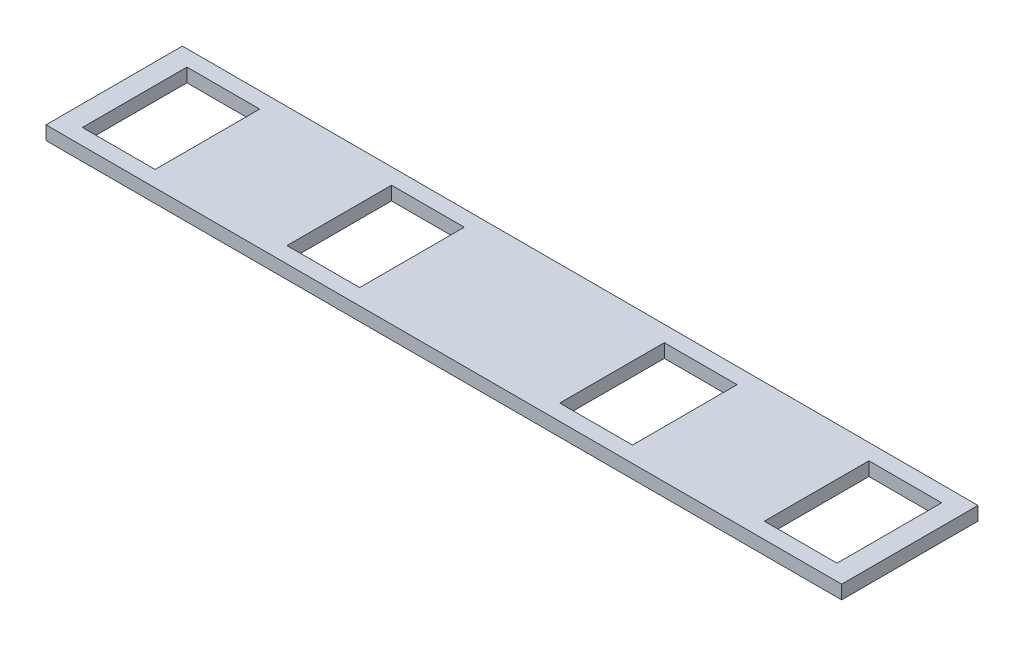
ISO-10303-21;
HEADER;
FILE_DESCRIPTION(('STEP AP214'),'2;1');
FILE_NAME('part.step','',(''),(''),'','','');
FILE_SCHEMA(('AUTOMOTIVE_DESIGN { 1 0 10303 214 1 1 1 1 }'));
ENDSEC;
DATA;
#1=APPLICATION_CONTEXT('core data for automotive mechanical design processes');
#2=APPLICATION_PROTOCOL_DEFINITION('international standard','automotive_design',2000,#1);
#3=PRODUCT_CONTEXT('',#1,'mechanical');
#4=PRODUCT('Part','Part','',(#3));
#5=PRODUCT_RELATED_PRODUCT_CATEGORY('part','',(#4));
#6=PRODUCT_DEFINITION_FORMATION('','',#4);
#7=PRODUCT_DEFINITION_CONTEXT('part definition',#1,'design');
#8=PRODUCT_DEFINITION('design','',#6,#7);
#9=PRODUCT_DEFINITION_SHAPE('','',#8);
#10=(LENGTH_UNIT() NAMED_UNIT(*) SI_UNIT(.MILLI.,.METRE.));
#11=(NAMED_UNIT(*) PLANE_ANGLE_UNIT() SI_UNIT($,.RADIAN.));
#12=(NAMED_UNIT(*) SI_UNIT($,.STERADIAN.) SOLID_ANGLE_UNIT());
#13=UNCERTAINTY_MEASURE_WITH_UNIT(LENGTH_MEASURE(1.E-05),#10,'distance_accuracy_value','');
#14=(GEOMETRIC_REPRESENTATION_CONTEXT(3) GLOBAL_UNCERTAINTY_ASSIGNED_CONTEXT((#13)) GLOBAL_UNIT_ASSIGNED_CONTEXT((#10,
#11,#12)) REPRESENTATION_CONTEXT('',''));
#15=CARTESIAN_POINT('',(0.,0.,0.));
#16=DIRECTION('',(0.,0.,1.));
#17=DIRECTION('',(1.,0.,0.));
#18=AXIS2_PLACEMENT_3D('',#15,#16,#17);
#19=CARTESIAN_POINT('',(0.,3.,0.));
#20=DIRECTION('',(0.,-1.,0.));
#21=DIRECTION('',(0.,0.,-1.));
#22=AXIS2_PLACEMENT_3D('',#19,#20,#21);
#23=PLANE('',#22);
#24=DIRECTION('',(1.,0.,0.));
#25=VECTOR('',#24,1.);
#26=CARTESIAN_POINT('',(38.,3.,11.5));
#27=LINE('',#26,#25);
#28=CARTESIAN_POINT('',(22.,3.,11.5));
#29=VERTEX_POINT('',#28);
#30=CARTESIAN_POINT('',(38.,3.,11.5));
#31=VERTEX_POINT('',#30);
#32=EDGE_CURVE('E212',#29,#31,#27,.T.);
#33=ORIENTED_EDGE('',*,*,#32,.F.);
#34=DIRECTION('',(0.,0.,1.));
#35=VECTOR('',#34,1.);
#36=CARTESIAN_POINT('',(22.,3.,11.5));
#37=LINE('',#36,#35);
#38=CARTESIAN_POINT('',(22.,3.,-11.5));
#39=VERTEX_POINT('',#38);
#40=EDGE_CURVE('E220',#39,#29,#37,.T.);
#41=ORIENTED_EDGE('',*,*,#40,.F.);
#42=DIRECTION('',(-1.,0.,0.));
#43=VECTOR('',#42,1.);
#44=CARTESIAN_POINT('',(38.,3.,-11.5));
#45=LINE('',#44,#43);
#46=CARTESIAN_POINT('',(38.,3.,-11.5));
#47=VERTEX_POINT('',#46);
#48=EDGE_CURVE('E217',#47,#39,#45,.T.);
#49=ORIENTED_EDGE('',*,*,#48,.F.);
#50=DIRECTION('',(0.,0.,-1.));
#51=VECTOR('',#50,1.);
#52=CARTESIAN_POINT('',(38.,3.,11.5));
#53=LINE('',#52,#51);
#54=EDGE_CURVE('E214',#31,#47,#53,.T.);
#55=ORIENTED_EDGE('',*,*,#54,.F.);
#56=EDGE_LOOP('',(#33,#41,#49,#55));
#57=FACE_BOUND('',#56,.T.);
#58=DIRECTION('',(0.,0.,-1.));
#59=VECTOR('',#58,1.);
#60=CARTESIAN_POINT('',(-22.,3.,11.5));
#61=LINE('',#60,#59);
#62=CARTESIAN_POINT('',(-22.,3.,11.5));
#63=VERTEX_POINT('',#62);
#64=CARTESIAN_POINT('',(-22.,3.,-11.5));
#65=VERTEX_POINT('',#64);
#66=EDGE_CURVE('E274',#63,#65,#61,.T.);
#67=ORIENTED_EDGE('',*,*,#66,.F.);
#68=DIRECTION('',(1.,0.,0.));
#69=VECTOR('',#68,1.);
#70=CARTESIAN_POINT('',(-38.,3.,11.5));
#71=LINE('',#70,#69);
#72=CARTESIAN_POINT('',(-38.,3.,11.5));
#73=VERTEX_POINT('',#72);
#74=EDGE_CURVE('E282',#73,#63,#71,.T.);
#75=ORIENTED_EDGE('',*,*,#74,.F.);
#76=DIRECTION('',(0.,0.,1.));
#77=VECTOR('',#76,1.);
#78=CARTESIAN_POINT('',(-38.,3.,11.5));
#79=LINE('',#78,#77);
#80=CARTESIAN_POINT('',(-38.,3.,-11.5));
#81=VERTEX_POINT('',#80);
#82=EDGE_CURVE('E279',#81,#73,#79,.T.);
#83=ORIENTED_EDGE('',*,*,#82,.F.);
#84=DIRECTION('',(-1.,0.,0.));
#85=VECTOR('',#84,1.);
#86=CARTESIAN_POINT('',(-38.,3.,-11.5));
#87=LINE('',#86,#85);
#88=EDGE_CURVE('E276',#65,#81,#87,.T.);
#89=ORIENTED_EDGE('',*,*,#88,.F.);
#90=EDGE_LOOP('',(#67,#75,#83,#89));
#91=FACE_BOUND('',#90,.T.);
#92=DIRECTION('',(0.,0.,-1.));
#93=VECTOR('',#92,1.);
#94=CARTESIAN_POINT('',(87.5,3.,15.));
#95=LINE('',#94,#93);
#96=CARTESIAN_POINT('',(87.5,3.,15.));
#97=VERTEX_POINT('',#96);
#98=CARTESIAN_POINT('',(87.5,3.,-15.));
#99=VERTEX_POINT('',#98);
#100=EDGE_CURVE('E305',#97,#99,#95,.T.);
#101=ORIENTED_EDGE('',*,*,#100,.T.);
#102=DIRECTION('',(-1.,0.,0.));
#103=VECTOR('',#102,1.);
#104=CARTESIAN_POINT('',(-87.5,3.,-15.));
#105=LINE('',#104,#103);
#106=CARTESIAN_POINT('',(-87.5,3.,-15.));
#107=VERTEX_POINT('',#106);
#108=EDGE_CURVE('E308',#99,#107,#105,.T.);
#109=ORIENTED_EDGE('',*,*,#108,.T.);
#110=DIRECTION('',(0.,0.,1.));
#111=VECTOR('',#110,1.);
#112=CARTESIAN_POINT('',(-87.5,3.,15.));
#113=LINE('',#112,#111);
#114=CARTESIAN_POINT('',(-87.5,3.,15.));
#115=VERTEX_POINT('',#114);
#116=EDGE_CURVE('E311',#107,#115,#113,.T.);
#117=ORIENTED_EDGE('',*,*,#116,.T.);
#118=DIRECTION('',(1.,0.,0.));
#119=VECTOR('',#118,1.);
#120=CARTESIAN_POINT('',(-87.5,3.,15.));
#121=LINE('',#120,#119);
#122=EDGE_CURVE('E313',#115,#97,#121,.T.);
#123=ORIENTED_EDGE('',*,*,#122,.T.);
#124=EDGE_LOOP('',(#101,#109,#117,#123));
#125=FACE_BOUND('',#124,.T.);
#126=DIRECTION('',(0.,0.,-1.));
#127=VECTOR('',#126,1.);
#128=CARTESIAN_POINT('',(-67.,3.,11.5000000000003));
#129=LINE('',#128,#127);
#130=CARTESIAN_POINT('',(-67.,3.,11.5000000000003));
#131=VERTEX_POINT('',#130);
#132=CARTESIAN_POINT('',(-67.,3.,-11.4999999999997));
#133=VERTEX_POINT('',#132);
#134=EDGE_CURVE('E243',#131,#133,#129,.T.);
#135=ORIENTED_EDGE('',*,*,#134,.F.);
#136=DIRECTION('',(1.,0.,0.));
#137=VECTOR('',#136,1.);
#138=CARTESIAN_POINT('',(-83.,3.,11.5000000000003));
#139=LINE('',#138,#137);
#140=CARTESIAN_POINT('',(-83.,3.,11.5000000000003));
#141=VERTEX_POINT('',#140);
#142=EDGE_CURVE('E251',#141,#131,#139,.T.);
#143=ORIENTED_EDGE('',*,*,#142,.F.);
#144=DIRECTION('',(0.,0.,1.));
#145=VECTOR('',#144,1.);
#146=CARTESIAN_POINT('',(-83.,3.,11.5000000000003));
#147=LINE('',#146,#145);
#148=CARTESIAN_POINT('',(-83.,3.,-11.4999999999997));
#149=VERTEX_POINT('',#148);
#150=EDGE_CURVE('E248',#149,#141,#147,.T.);
#151=ORIENTED_EDGE('',*,*,#150,.F.);
#152=DIRECTION('',(-1.,0.,0.));
#153=VECTOR('',#152,1.);
#154=CARTESIAN_POINT('',(-83.,3.,-11.4999999999997));
#155=LINE('',#154,#153);
#156=EDGE_CURVE('E245',#133,#149,#155,.T.);
#157=ORIENTED_EDGE('',*,*,#156,.F.);
#158=EDGE_LOOP('',(#135,#143,#151,#157));
#159=FACE_BOUND('',#158,.T.);
#160=DIRECTION('',(1.,0.,0.));
#161=VECTOR('',#160,1.);
#162=CARTESIAN_POINT('',(83.,3.,11.5));
#163=LINE('',#162,#161);
#164=CARTESIAN_POINT('',(67.,3.,11.5));
#165=VERTEX_POINT('',#164);
#166=CARTESIAN_POINT('',(83.,3.,11.5));
#167=VERTEX_POINT('',#166);
#168=EDGE_CURVE('E176',#165,#167,#163,.T.);
#169=ORIENTED_EDGE('',*,*,#168,.F.);
#170=DIRECTION('',(0.,0.,1.));
#171=VECTOR('',#170,1.);
#172=CARTESIAN_POINT('',(67.,3.,11.5));
#173=LINE('',#172,#171);
#174=CARTESIAN_POINT('',(67.,3.,-11.5));
#175=VERTEX_POINT('',#174);
#176=EDGE_CURVE('E198',#175,#165,#173,.T.);
#177=ORIENTED_EDGE('',*,*,#176,.F.);
#178=DIRECTION('',(-1.,0.,0.));
#179=VECTOR('',#178,1.);
#180=CARTESIAN_POINT('',(83.,3.,-11.5));
#181=LINE('',#180,#179);
#182=CARTESIAN_POINT('',(83.,3.,-11.5));
#183=VERTEX_POINT('',#182);
#184=EDGE_CURVE('E196',#183,#175,#181,.T.);
#185=ORIENTED_EDGE('',*,*,#184,.F.);
#186=DIRECTION('',(0.,0.,-1.));
#187=VECTOR('',#186,1.);
#188=CARTESIAN_POINT('',(83.,3.,11.5));
#189=LINE('',#188,#187);
#190=EDGE_CURVE('E184',#167,#183,#189,.T.);
#191=ORIENTED_EDGE('',*,*,#190,.F.);
#192=EDGE_LOOP('',(#169,#177,#185,#191));
#193=FACE_BOUND('',#192,.T.);
#194=ADVANCED_FACE('F39',(#57,#91,#125,#159,#193),#23,.F.);
#195=CARTESIAN_POINT('',(0.,0.,0.));
#196=DIRECTION('',(0.,-1.,0.));
#197=DIRECTION('',(0.,0.,-1.));
#198=AXIS2_PLACEMENT_3D('',#195,#196,#197);
#199=PLANE('',#198);
#200=DIRECTION('',(0.,0.,-1.));
#201=VECTOR('',#200,1.);
#202=CARTESIAN_POINT('',(87.5,0.,15.));
#203=LINE('',#202,#201);
#204=CARTESIAN_POINT('',(87.5,0.,15.));
#205=VERTEX_POINT('',#204);
#206=CARTESIAN_POINT('',(87.5,0.,-15.));
#207=VERTEX_POINT('',#206);
#208=EDGE_CURVE('E304',#205,#207,#203,.T.);
#209=ORIENTED_EDGE('',*,*,#208,.F.);
#210=DIRECTION('',(1.,0.,0.));
#211=VECTOR('',#210,1.);
#212=CARTESIAN_POINT('',(-87.5,0.,15.));
#213=LINE('',#212,#211);
#214=CARTESIAN_POINT('',(-87.5,0.,15.));
#215=VERTEX_POINT('',#214);
#216=EDGE_CURVE('E309',#215,#205,#213,.T.);
#217=ORIENTED_EDGE('',*,*,#216,.F.);
#218=DIRECTION('',(0.,0.,1.));
#219=VECTOR('',#218,1.);
#220=CARTESIAN_POINT('',(-87.5,0.,15.));
#221=LINE('',#220,#219);
#222=CARTESIAN_POINT('',(-87.5,0.,-15.));
#223=VERTEX_POINT('',#222);
#224=EDGE_CURVE('E320',#223,#215,#221,.T.);
#225=ORIENTED_EDGE('',*,*,#224,.F.);
#226=DIRECTION('',(-1.,0.,0.));
#227=VECTOR('',#226,1.);
#228=CARTESIAN_POINT('',(-87.5,0.,-15.));
#229=LINE('',#228,#227);
#230=EDGE_CURVE('E318',#207,#223,#229,.T.);
#231=ORIENTED_EDGE('',*,*,#230,.F.);
#232=EDGE_LOOP('',(#209,#217,#225,#231));
#233=FACE_BOUND('',#232,.T.);
#234=DIRECTION('',(1.,0.,0.));
#235=VECTOR('',#234,1.);
#236=CARTESIAN_POINT('',(-38.,0.,11.5));
#237=LINE('',#236,#235);
#238=CARTESIAN_POINT('',(-38.,0.,11.5));
#239=VERTEX_POINT('',#238);
#240=CARTESIAN_POINT('',(-22.,0.,11.5));
#241=VERTEX_POINT('',#240);
#242=EDGE_CURVE('E277',#239,#241,#237,.T.);
#243=ORIENTED_EDGE('',*,*,#242,.T.);
#244=DIRECTION('',(0.,0.,-1.));
#245=VECTOR('',#244,1.);
#246=CARTESIAN_POINT('',(-22.,0.,11.5));
#247=LINE('',#246,#245);
#248=CARTESIAN_POINT('',(-22.,0.,-11.5));
#249=VERTEX_POINT('',#248);
#250=EDGE_CURVE('E273',#241,#249,#247,.T.);
#251=ORIENTED_EDGE('',*,*,#250,.T.);
#252=DIRECTION('',(-1.,0.,0.));
#253=VECTOR('',#252,1.);
#254=CARTESIAN_POINT('',(-38.,0.,-11.5));
#255=LINE('',#254,#253);
#256=CARTESIAN_POINT('',(-38.,0.,-11.5));
#257=VERTEX_POINT('',#256);
#258=EDGE_CURVE('E287',#249,#257,#255,.T.);
#259=ORIENTED_EDGE('',*,*,#258,.T.);
#260=DIRECTION('',(0.,0.,1.));
#261=VECTOR('',#260,1.);
#262=CARTESIAN_POINT('',(-38.,0.,11.5));
#263=LINE('',#262,#261);
#264=EDGE_CURVE('E290',#257,#239,#263,.T.);
#265=ORIENTED_EDGE('',*,*,#264,.T.);
#266=EDGE_LOOP('',(#243,#251,#259,#265));
#267=FACE_BOUND('',#266,.T.);
#268=DIRECTION('',(1.,0.,0.));
#269=VECTOR('',#268,1.);
#270=CARTESIAN_POINT('',(-83.,0.,11.5000000000003));
#271=LINE('',#270,#269);
#272=CARTESIAN_POINT('',(-83.,0.,11.5000000000003));
#273=VERTEX_POINT('',#272);
#274=CARTESIAN_POINT('',(-67.,0.,11.5000000000003));
#275=VERTEX_POINT('',#274);
#276=EDGE_CURVE('E246',#273,#275,#271,.T.);
#277=ORIENTED_EDGE('',*,*,#276,.T.);
#278=DIRECTION('',(0.,0.,-1.));
#279=VECTOR('',#278,1.);
#280=CARTESIAN_POINT('',(-67.,0.,11.5000000000003));
#281=LINE('',#280,#279);
#282=CARTESIAN_POINT('',(-67.,0.,-11.4999999999997));
#283=VERTEX_POINT('',#282);
#284=EDGE_CURVE('E242',#275,#283,#281,.T.);
#285=ORIENTED_EDGE('',*,*,#284,.T.);
#286=DIRECTION('',(-1.,0.,0.));
#287=VECTOR('',#286,1.);
#288=CARTESIAN_POINT('',(-83.,0.,-11.4999999999997));
#289=LINE('',#288,#287);
#290=CARTESIAN_POINT('',(-83.,0.,-11.4999999999997));
#291=VERTEX_POINT('',#290);
#292=EDGE_CURVE('E256',#283,#291,#289,.T.);
#293=ORIENTED_EDGE('',*,*,#292,.T.);
#294=DIRECTION('',(0.,0.,1.));
#295=VECTOR('',#294,1.);
#296=CARTESIAN_POINT('',(-83.,0.,11.5000000000003));
#297=LINE('',#296,#295);
#298=EDGE_CURVE('E259',#291,#273,#297,.T.);
#299=ORIENTED_EDGE('',*,*,#298,.T.);
#300=EDGE_LOOP('',(#277,#285,#293,#299));
#301=FACE_BOUND('',#300,.T.);
#302=DIRECTION('',(0.,0.,1.));
#303=VECTOR('',#302,1.);
#304=CARTESIAN_POINT('',(22.,0.,11.5));
#305=LINE('',#304,#303);
#306=CARTESIAN_POINT('',(22.,0.,-11.5));
#307=VERTEX_POINT('',#306);
#308=CARTESIAN_POINT('',(22.,0.,11.5));
#309=VERTEX_POINT('',#308);
#310=EDGE_CURVE('E215',#307,#309,#305,.T.);
#311=ORIENTED_EDGE('',*,*,#310,.T.);
#312=DIRECTION('',(1.,0.,0.));
#313=VECTOR('',#312,1.);
#314=CARTESIAN_POINT('',(38.,0.,11.5));
#315=LINE('',#314,#313);
#316=CARTESIAN_POINT('',(38.,0.,11.5));
#317=VERTEX_POINT('',#316);
#318=EDGE_CURVE('E192',#309,#317,#315,.T.);
#319=ORIENTED_EDGE('',*,*,#318,.T.);
#320=DIRECTION('',(0.,0.,-1.));
#321=VECTOR('',#320,1.);
#322=CARTESIAN_POINT('',(38.,0.,11.5));
#323=LINE('',#322,#321);
#324=CARTESIAN_POINT('',(38.,0.,-11.5));
#325=VERTEX_POINT('',#324);
#326=EDGE_CURVE('E225',#317,#325,#323,.T.);
#327=ORIENTED_EDGE('',*,*,#326,.T.);
#328=DIRECTION('',(-1.,0.,0.));
#329=VECTOR('',#328,1.);
#330=CARTESIAN_POINT('',(38.,0.,-11.5));
#331=LINE('',#330,#329);
#332=EDGE_CURVE('E228',#325,#307,#331,.T.);
#333=ORIENTED_EDGE('',*,*,#332,.T.);
#334=EDGE_LOOP('',(#311,#319,#327,#333));
#335=FACE_BOUND('',#334,.T.);
#336=DIRECTION('',(0.,0.,1.));
#337=VECTOR('',#336,1.);
#338=CARTESIAN_POINT('',(67.,0.,11.5));
#339=LINE('',#338,#337);
#340=CARTESIAN_POINT('',(67.,0.,-11.5));
#341=VERTEX_POINT('',#340);
#342=CARTESIAN_POINT('',(67.,0.,11.5));
#343=VERTEX_POINT('',#342);
#344=EDGE_CURVE('E185',#341,#343,#339,.T.);
#345=ORIENTED_EDGE('',*,*,#344,.T.);
#346=DIRECTION('',(1.,0.,0.));
#347=VECTOR('',#346,1.);
#348=CARTESIAN_POINT('',(83.,0.,11.5));
#349=LINE('',#348,#347);
#350=CARTESIAN_POINT('',(83.,0.,11.5));
#351=VERTEX_POINT('',#350);
#352=EDGE_CURVE('E62',#343,#351,#349,.T.);
#353=ORIENTED_EDGE('',*,*,#352,.T.);
#354=DIRECTION('',(0.,0.,-1.));
#355=VECTOR('',#354,1.);
#356=CARTESIAN_POINT('',(83.,0.,11.5));
#357=LINE('',#356,#355);
#358=CARTESIAN_POINT('',(83.,0.,-11.5));
#359=VERTEX_POINT('',#358);
#360=EDGE_CURVE('E191',#351,#359,#357,.T.);
#361=ORIENTED_EDGE('',*,*,#360,.T.);
#362=DIRECTION('',(-1.,0.,0.));
#363=VECTOR('',#362,1.);
#364=CARTESIAN_POINT('',(83.,0.,-11.5));
#365=LINE('',#364,#363);
#366=EDGE_CURVE('E204',#359,#341,#365,.T.);
#367=ORIENTED_EDGE('',*,*,#366,.T.);
#368=EDGE_LOOP('',(#345,#353,#361,#367));
#369=FACE_BOUND('',#368,.T.);
#370=ADVANCED_FACE('F338',(#233,#267,#301,#335,#369),#199,.T.);
#371=CARTESIAN_POINT('',(87.5,3.,15.));
#372=DIRECTION('',(-1.,0.,0.));
#373=DIRECTION('',(0.,0.,1.));
#374=AXIS2_PLACEMENT_3D('',#371,#372,#373);
#375=PLANE('',#374);
#376=ORIENTED_EDGE('',*,*,#208,.T.);
#377=DIRECTION('',(0.,-1.,0.));
#378=VECTOR('',#377,1.);
#379=CARTESIAN_POINT('',(87.5,3.,-15.));
#380=LINE('',#379,#378);
#381=EDGE_CURVE('E11',#99,#207,#380,.T.);
#382=ORIENTED_EDGE('',*,*,#381,.F.);
#383=ORIENTED_EDGE('',*,*,#100,.F.);
#384=DIRECTION('',(0.,-1.,0.));
#385=VECTOR('',#384,1.);
#386=CARTESIAN_POINT('',(87.5,3.,15.));
#387=LINE('',#386,#385);
#388=EDGE_CURVE('E315',#97,#205,#387,.T.);
#389=ORIENTED_EDGE('',*,*,#388,.T.);
#390=EDGE_LOOP('',(#376,#382,#383,#389));
#391=FACE_BOUND('',#390,.T.);
#392=ADVANCED_FACE('F41',(#391),#375,.F.);
#393=CARTESIAN_POINT('',(-87.5,3.,-15.));
#394=DIRECTION('',(0.,0.,1.));
#395=DIRECTION('',(1.,0.,0.));
#396=AXIS2_PLACEMENT_3D('',#393,#394,#395);
#397=PLANE('',#396);
#398=ORIENTED_EDGE('',*,*,#230,.T.);
#399=DIRECTION('',(0.,-1.,0.));
#400=VECTOR('',#399,1.);
#401=CARTESIAN_POINT('',(-87.5,3.,-15.));
#402=LINE('',#401,#400);
#403=EDGE_CURVE('E47',#107,#223,#402,.T.);
#404=ORIENTED_EDGE('',*,*,#403,.F.);
#405=ORIENTED_EDGE('',*,*,#108,.F.);
#406=ORIENTED_EDGE('',*,*,#381,.T.);
#407=EDGE_LOOP('',(#398,#404,#405,#406));
#408=FACE_BOUND('',#407,.T.);
#409=ADVANCED_FACE('F349',(#408),#397,.F.);
#410=CARTESIAN_POINT('',(-87.5,3.,15.));
#411=DIRECTION('',(1.,0.,0.));
#412=DIRECTION('',(0.,0.,-1.));
#413=AXIS2_PLACEMENT_3D('',#410,#411,#412);
#414=PLANE('',#413);
#415=ORIENTED_EDGE('',*,*,#224,.T.);
#416=DIRECTION('',(0.,-1.,0.));
#417=VECTOR('',#416,1.);
#418=CARTESIAN_POINT('',(-87.5,3.,15.));
#419=LINE('',#418,#417);
#420=EDGE_CURVE('E325',#115,#215,#419,.T.);
#421=ORIENTED_EDGE('',*,*,#420,.F.);
#422=ORIENTED_EDGE('',*,*,#116,.F.);
#423=ORIENTED_EDGE('',*,*,#403,.T.);
#424=EDGE_LOOP('',(#415,#421,#422,#423));
#425=FACE_BOUND('',#424,.T.);
#426=ADVANCED_FACE('F332',(#425),#414,.F.);
#427=CARTESIAN_POINT('',(-87.5,3.,15.));
#428=DIRECTION('',(0.,0.,-1.));
#429=DIRECTION('',(-1.,0.,0.));
#430=AXIS2_PLACEMENT_3D('',#427,#428,#429);
#431=PLANE('',#430);
#432=ORIENTED_EDGE('',*,*,#216,.T.);
#433=ORIENTED_EDGE('',*,*,#388,.F.);
#434=ORIENTED_EDGE('',*,*,#122,.F.);
#435=ORIENTED_EDGE('',*,*,#420,.T.);
#436=EDGE_LOOP('',(#432,#433,#434,#435));
#437=FACE_BOUND('',#436,.T.);
#438=ADVANCED_FACE('F342',(#437),#431,.F.);
#439=CARTESIAN_POINT('',(-22.,3.,11.5));
#440=DIRECTION('',(-1.,0.,0.));
#441=DIRECTION('',(0.,0.,1.));
#442=AXIS2_PLACEMENT_3D('',#439,#440,#441);
#443=PLANE('',#442);
#444=ORIENTED_EDGE('',*,*,#250,.F.);
#445=DIRECTION('',(0.,-1.,0.));
#446=VECTOR('',#445,1.);
#447=CARTESIAN_POINT('',(-22.,3.,11.5));
#448=LINE('',#447,#446);
#449=EDGE_CURVE('E284',#63,#241,#448,.T.);
#450=ORIENTED_EDGE('',*,*,#449,.F.);
#451=ORIENTED_EDGE('',*,*,#66,.T.);
#452=DIRECTION('',(0.,-1.,0.));
#453=VECTOR('',#452,1.);
#454=CARTESIAN_POINT('',(-22.,3.,-11.5));
#455=LINE('',#454,#453);
#456=EDGE_CURVE('E301',#65,#249,#455,.T.);
#457=ORIENTED_EDGE('',*,*,#456,.T.);
#458=EDGE_LOOP('',(#444,#450,#451,#457));
#459=FACE_BOUND('',#458,.T.);
#460=ADVANCED_FACE('F366',(#459),#443,.T.);
#461=CARTESIAN_POINT('',(-38.,3.,-11.5));
#462=DIRECTION('',(0.,0.,1.));
#463=DIRECTION('',(1.,0.,0.));
#464=AXIS2_PLACEMENT_3D('',#461,#462,#463);
#465=PLANE('',#464);
#466=ORIENTED_EDGE('',*,*,#258,.F.);
#467=ORIENTED_EDGE('',*,*,#456,.F.);
#468=ORIENTED_EDGE('',*,*,#88,.T.);
#469=DIRECTION('',(0.,-1.,0.));
#470=VECTOR('',#469,1.);
#471=CARTESIAN_POINT('',(-38.,3.,-11.5));
#472=LINE('',#471,#470);
#473=EDGE_CURVE('E299',#81,#257,#472,.T.);
#474=ORIENTED_EDGE('',*,*,#473,.T.);
#475=EDGE_LOOP('',(#466,#467,#468,#474));
#476=FACE_BOUND('',#475,.T.);
#477=ADVANCED_FACE('F373',(#476),#465,.T.);
#478=CARTESIAN_POINT('',(-38.,3.,11.5));
#479=DIRECTION('',(1.,0.,0.));
#480=DIRECTION('',(0.,0.,-1.));
#481=AXIS2_PLACEMENT_3D('',#478,#479,#480);
#482=PLANE('',#481);
#483=ORIENTED_EDGE('',*,*,#264,.F.);
#484=ORIENTED_EDGE('',*,*,#473,.F.);
#485=ORIENTED_EDGE('',*,*,#82,.T.);
#486=DIRECTION('',(0.,-1.,0.));
#487=VECTOR('',#486,1.);
#488=CARTESIAN_POINT('',(-38.,3.,11.5));
#489=LINE('',#488,#487);
#490=EDGE_CURVE('E297',#73,#239,#489,.T.);
#491=ORIENTED_EDGE('',*,*,#490,.T.);
#492=EDGE_LOOP('',(#483,#484,#485,#491));
#493=FACE_BOUND('',#492,.T.);
#494=ADVANCED_FACE('F378',(#493),#482,.T.);
#495=CARTESIAN_POINT('',(-38.,3.,11.5));
#496=DIRECTION('',(0.,0.,-1.));
#497=DIRECTION('',(-1.,0.,0.));
#498=AXIS2_PLACEMENT_3D('',#495,#496,#497);
#499=PLANE('',#498);
#500=ORIENTED_EDGE('',*,*,#242,.F.);
#501=ORIENTED_EDGE('',*,*,#490,.F.);
#502=ORIENTED_EDGE('',*,*,#74,.T.);
#503=ORIENTED_EDGE('',*,*,#449,.T.);
#504=EDGE_LOOP('',(#500,#501,#502,#503));
#505=FACE_BOUND('',#504,.T.);
#506=ADVANCED_FACE('F385',(#505),#499,.T.);
#507=CARTESIAN_POINT('',(-67.,3.,11.5000000000003));
#508=DIRECTION('',(-1.,0.,0.));
#509=DIRECTION('',(0.,0.,1.));
#510=AXIS2_PLACEMENT_3D('',#507,#508,#509);
#511=PLANE('',#510);
#512=ORIENTED_EDGE('',*,*,#284,.F.);
#513=DIRECTION('',(0.,-1.,0.));
#514=VECTOR('',#513,1.);
#515=CARTESIAN_POINT('',(-67.,3.,11.5000000000003));
#516=LINE('',#515,#514);
#517=EDGE_CURVE('E253',#131,#275,#516,.T.);
#518=ORIENTED_EDGE('',*,*,#517,.F.);
#519=ORIENTED_EDGE('',*,*,#134,.T.);
#520=DIRECTION('',(0.,-1.,0.));
#521=VECTOR('',#520,1.);
#522=CARTESIAN_POINT('',(-67.,3.,-11.4999999999997));
#523=LINE('',#522,#521);
#524=EDGE_CURVE('E270',#133,#283,#523,.T.);
#525=ORIENTED_EDGE('',*,*,#524,.T.);
#526=EDGE_LOOP('',(#512,#518,#519,#525));
#527=FACE_BOUND('',#526,.T.);
#528=ADVANCED_FACE('F398',(#527),#511,.T.);
#529=CARTESIAN_POINT('',(-83.,3.,-11.4999999999997));
#530=DIRECTION('',(0.,0.,1.));
#531=DIRECTION('',(1.,0.,0.));
#532=AXIS2_PLACEMENT_3D('',#529,#530,#531);
#533=PLANE('',#532);
#534=ORIENTED_EDGE('',*,*,#292,.F.);
#535=ORIENTED_EDGE('',*,*,#524,.F.);
#536=ORIENTED_EDGE('',*,*,#156,.T.);
#537=DIRECTION('',(0.,-1.,0.));
#538=VECTOR('',#537,1.);
#539=CARTESIAN_POINT('',(-83.,3.,-11.4999999999997));
#540=LINE('',#539,#538);
#541=EDGE_CURVE('E268',#149,#291,#540,.T.);
#542=ORIENTED_EDGE('',*,*,#541,.T.);
#543=EDGE_LOOP('',(#534,#535,#536,#542));
#544=FACE_BOUND('',#543,.T.);
#545=ADVANCED_FACE('F403',(#544),#533,.T.);
#546=CARTESIAN_POINT('',(-83.,3.,11.5000000000003));
#547=DIRECTION('',(1.,0.,0.));
#548=DIRECTION('',(0.,0.,-1.));
#549=AXIS2_PLACEMENT_3D('',#546,#547,#548);
#550=PLANE('',#549);
#551=ORIENTED_EDGE('',*,*,#298,.F.);
#552=ORIENTED_EDGE('',*,*,#541,.F.);
#553=ORIENTED_EDGE('',*,*,#150,.T.);
#554=DIRECTION('',(0.,-1.,0.));
#555=VECTOR('',#554,1.);
#556=CARTESIAN_POINT('',(-83.,3.,11.5000000000003));
#557=LINE('',#556,#555);
#558=EDGE_CURVE('E266',#141,#273,#557,.T.);
#559=ORIENTED_EDGE('',*,*,#558,.T.);
#560=EDGE_LOOP('',(#551,#552,#553,#559));
#561=FACE_BOUND('',#560,.T.);
#562=ADVANCED_FACE('F407',(#561),#550,.T.);
#563=CARTESIAN_POINT('',(-83.,3.,11.5000000000003));
#564=DIRECTION('',(0.,0.,-1.));
#565=DIRECTION('',(-1.,0.,0.));
#566=AXIS2_PLACEMENT_3D('',#563,#564,#565);
#567=PLANE('',#566);
#568=ORIENTED_EDGE('',*,*,#276,.F.);
#569=ORIENTED_EDGE('',*,*,#558,.F.);
#570=ORIENTED_EDGE('',*,*,#142,.T.);
#571=ORIENTED_EDGE('',*,*,#517,.T.);
#572=EDGE_LOOP('',(#568,#569,#570,#571));
#573=FACE_BOUND('',#572,.T.);
#574=ADVANCED_FACE('F411',(#573),#567,.T.);
#575=CARTESIAN_POINT('',(38.,3.,11.5));
#576=DIRECTION('',(0.,0.,-1.));
#577=DIRECTION('',(-1.,0.,0.));
#578=AXIS2_PLACEMENT_3D('',#575,#576,#577);
#579=PLANE('',#578);
#580=ORIENTED_EDGE('',*,*,#318,.F.);
#581=DIRECTION('',(0.,-1.,0.));
#582=VECTOR('',#581,1.);
#583=CARTESIAN_POINT('',(22.,3.,11.5));
#584=LINE('',#583,#582);
#585=EDGE_CURVE('E222',#29,#309,#584,.T.);
#586=ORIENTED_EDGE('',*,*,#585,.F.);
#587=ORIENTED_EDGE('',*,*,#32,.T.);
#588=DIRECTION('',(0.,-1.,0.));
#589=VECTOR('',#588,1.);
#590=CARTESIAN_POINT('',(38.,3.,11.5));
#591=LINE('',#590,#589);
#592=EDGE_CURVE('E239',#31,#317,#591,.T.);
#593=ORIENTED_EDGE('',*,*,#592,.T.);
#594=EDGE_LOOP('',(#580,#586,#587,#593));
#595=FACE_BOUND('',#594,.T.);
#596=ADVANCED_FACE('F415',(#595),#579,.T.);
#597=CARTESIAN_POINT('',(38.,3.,11.5));
#598=DIRECTION('',(-1.,0.,0.));
#599=DIRECTION('',(0.,0.,1.));
#600=AXIS2_PLACEMENT_3D('',#597,#598,#599);
#601=PLANE('',#600);
#602=ORIENTED_EDGE('',*,*,#326,.F.);
#603=ORIENTED_EDGE('',*,*,#592,.F.);
#604=ORIENTED_EDGE('',*,*,#54,.T.);
#605=DIRECTION('',(0.,-1.,0.));
#606=VECTOR('',#605,1.);
#607=CARTESIAN_POINT('',(38.,3.,-11.5));
#608=LINE('',#607,#606);
#609=EDGE_CURVE('E237',#47,#325,#608,.T.);
#610=ORIENTED_EDGE('',*,*,#609,.T.);
#611=EDGE_LOOP('',(#602,#603,#604,#610));
#612=FACE_BOUND('',#611,.T.);
#613=ADVANCED_FACE('F419',(#612),#601,.T.);
#614=CARTESIAN_POINT('',(38.,3.,-11.5));
#615=DIRECTION('',(0.,0.,1.));
#616=DIRECTION('',(1.,0.,0.));
#617=AXIS2_PLACEMENT_3D('',#614,#615,#616);
#618=PLANE('',#617);
#619=ORIENTED_EDGE('',*,*,#332,.F.);
#620=ORIENTED_EDGE('',*,*,#609,.F.);
#621=ORIENTED_EDGE('',*,*,#48,.T.);
#622=DIRECTION('',(0.,-1.,0.));
#623=VECTOR('',#622,1.);
#624=CARTESIAN_POINT('',(22.,3.,-11.5));
#625=LINE('',#624,#623);
#626=EDGE_CURVE('E235',#39,#307,#625,.T.);
#627=ORIENTED_EDGE('',*,*,#626,.T.);
#628=EDGE_LOOP('',(#619,#620,#621,#627));
#629=FACE_BOUND('',#628,.T.);
#630=ADVANCED_FACE('F423',(#629),#618,.T.);
#631=CARTESIAN_POINT('',(22.,3.,11.5));
#632=DIRECTION('',(1.,0.,0.));
#633=DIRECTION('',(0.,0.,-1.));
#634=AXIS2_PLACEMENT_3D('',#631,#632,#633);
#635=PLANE('',#634);
#636=ORIENTED_EDGE('',*,*,#310,.F.);
#637=ORIENTED_EDGE('',*,*,#626,.F.);
#638=ORIENTED_EDGE('',*,*,#40,.T.);
#639=ORIENTED_EDGE('',*,*,#585,.T.);
#640=EDGE_LOOP('',(#636,#637,#638,#639));
#641=FACE_BOUND('',#640,.T.);
#642=ADVANCED_FACE('F427',(#641),#635,.T.);
#643=CARTESIAN_POINT('',(83.,3.,11.5));
#644=DIRECTION('',(0.,0.,-1.));
#645=DIRECTION('',(-1.,0.,0.));
#646=AXIS2_PLACEMENT_3D('',#643,#644,#645);
#647=PLANE('',#646);
#648=ORIENTED_EDGE('',*,*,#352,.F.);
#649=DIRECTION('',(0.,-1.,0.));
#650=VECTOR('',#649,1.);
#651=CARTESIAN_POINT('',(67.,3.,11.5));
#652=LINE('',#651,#650);
#653=EDGE_CURVE('E180',#165,#343,#652,.T.);
#654=ORIENTED_EDGE('',*,*,#653,.F.);
#655=ORIENTED_EDGE('',*,*,#168,.T.);
#656=DIRECTION('',(0.,-1.,0.));
#657=VECTOR('',#656,1.);
#658=CARTESIAN_POINT('',(83.,3.,11.5));
#659=LINE('',#658,#657);
#660=EDGE_CURVE('E179',#167,#351,#659,.T.);
#661=ORIENTED_EDGE('',*,*,#660,.T.);
#662=EDGE_LOOP('',(#648,#654,#655,#661));
#663=FACE_BOUND('',#662,.T.);
#664=ADVANCED_FACE('F178',(#663),#647,.T.);
#665=CARTESIAN_POINT('',(83.,3.,11.5));
#666=DIRECTION('',(-1.,0.,0.));
#667=DIRECTION('',(0.,0.,1.));
#668=AXIS2_PLACEMENT_3D('',#665,#666,#667);
#669=PLANE('',#668);
#670=ORIENTED_EDGE('',*,*,#360,.F.);
#671=ORIENTED_EDGE('',*,*,#660,.F.);
#672=ORIENTED_EDGE('',*,*,#190,.T.);
#673=DIRECTION('',(0.,-1.,0.));
#674=VECTOR('',#673,1.);
#675=CARTESIAN_POINT('',(83.,3.,-11.5));
#676=LINE('',#675,#674);
#677=EDGE_CURVE('E193',#183,#359,#676,.T.);
#678=ORIENTED_EDGE('',*,*,#677,.T.);
#679=EDGE_LOOP('',(#670,#671,#672,#678));
#680=FACE_BOUND('',#679,.T.);
#681=ADVANCED_FACE('F188',(#680),#669,.T.);
#682=CARTESIAN_POINT('',(83.,3.,-11.5));
#683=DIRECTION('',(0.,0.,1.));
#684=DIRECTION('',(1.,0.,0.));
#685=AXIS2_PLACEMENT_3D('',#682,#683,#684);
#686=PLANE('',#685);
#687=ORIENTED_EDGE('',*,*,#366,.F.);
#688=ORIENTED_EDGE('',*,*,#677,.F.);
#689=ORIENTED_EDGE('',*,*,#184,.T.);
#690=DIRECTION('',(0.,-1.,0.));
#691=VECTOR('',#690,1.);
#692=CARTESIAN_POINT('',(67.,3.,-11.5));
#693=LINE('',#692,#691);
#694=EDGE_CURVE('E54',#175,#341,#693,.T.);
#695=ORIENTED_EDGE('',*,*,#694,.T.);
#696=EDGE_LOOP('',(#687,#688,#689,#695));
#697=FACE_BOUND('',#696,.T.);
#698=ADVANCED_FACE('F436',(#697),#686,.T.);
#699=CARTESIAN_POINT('',(67.,3.,11.5));
#700=DIRECTION('',(1.,0.,0.));
#701=DIRECTION('',(0.,0.,-1.));
#702=AXIS2_PLACEMENT_3D('',#699,#700,#701);
#703=PLANE('',#702);
#704=ORIENTED_EDGE('',*,*,#344,.F.);
#705=ORIENTED_EDGE('',*,*,#694,.F.);
#706=ORIENTED_EDGE('',*,*,#176,.T.);
#707=ORIENTED_EDGE('',*,*,#653,.T.);
#708=EDGE_LOOP('',(#704,#705,#706,#707));
#709=FACE_BOUND('',#708,.T.);
#710=ADVANCED_FACE('F439',(#709),#703,.T.);
#711=CLOSED_SHELL('',(#194,#370,#392,#409,#426,#438,#460,#477,#494,#506,#528,#545,#562,#574,
#596,#613,#630,#642,#664,#681,#698,#710));
#712=MANIFOLD_SOLID_BREP('B2',#711);
#713=ADVANCED_BREP_SHAPE_REPRESENTATION('',(#18,#712),#14);
#714=SHAPE_DEFINITION_REPRESENTATION(#9,#713);
ENDSEC;
END-ISO-10303-21;
